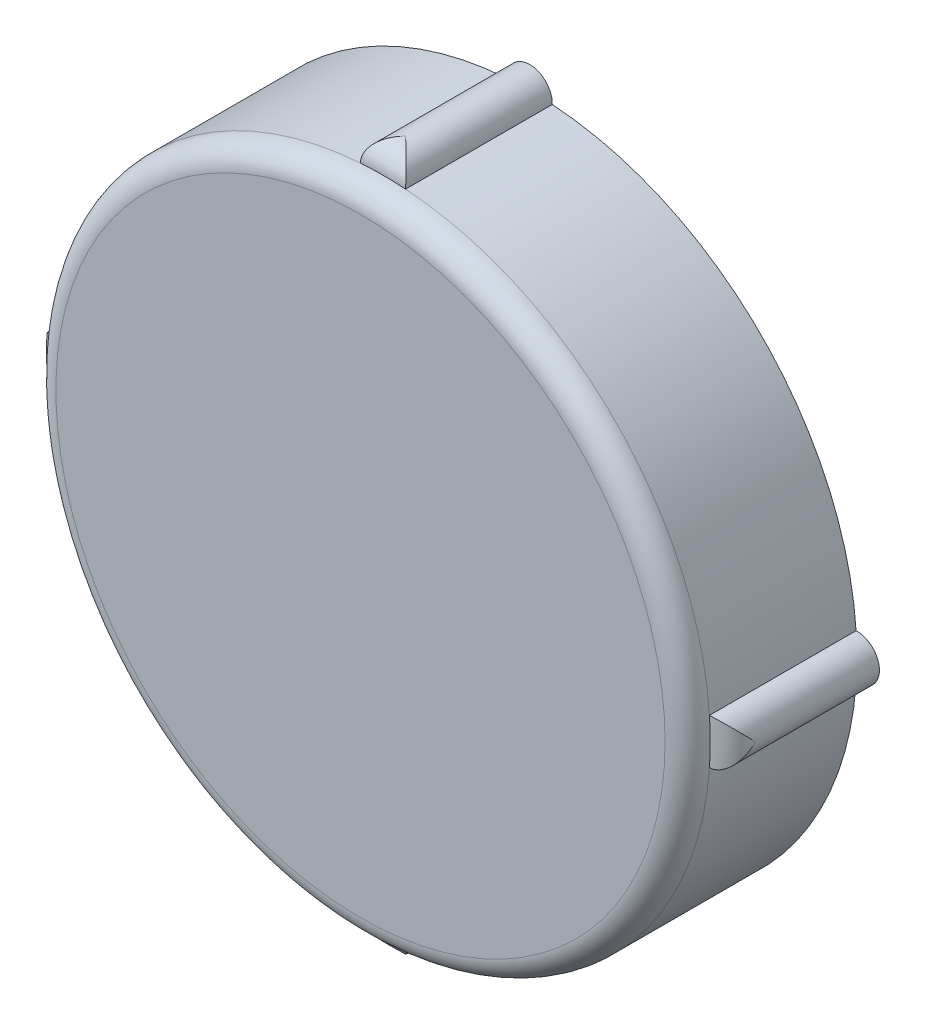
ISO-10303-21;
HEADER;
FILE_DESCRIPTION(('STEP AP214'),'2;1');
FILE_NAME('part.step','',(''),(''),'','','');
FILE_SCHEMA(('AUTOMOTIVE_DESIGN { 1 0 10303 214 1 1 1 1 }'));
ENDSEC;
DATA;
#1=APPLICATION_CONTEXT('core data for automotive mechanical design processes');
#2=APPLICATION_PROTOCOL_DEFINITION('international standard','automotive_design',2000,#1);
#3=PRODUCT_CONTEXT('',#1,'mechanical');
#4=PRODUCT('Part','Part','',(#3));
#5=PRODUCT_RELATED_PRODUCT_CATEGORY('part','',(#4));
#6=PRODUCT_DEFINITION_FORMATION('','',#4);
#7=PRODUCT_DEFINITION_CONTEXT('part definition',#1,'design');
#8=PRODUCT_DEFINITION('design','',#6,#7);
#9=PRODUCT_DEFINITION_SHAPE('','',#8);
#10=(LENGTH_UNIT() NAMED_UNIT(*) SI_UNIT(.MILLI.,.METRE.));
#11=(NAMED_UNIT(*) PLANE_ANGLE_UNIT() SI_UNIT($,.RADIAN.));
#12=(NAMED_UNIT(*) SI_UNIT($,.STERADIAN.) SOLID_ANGLE_UNIT());
#13=UNCERTAINTY_MEASURE_WITH_UNIT(LENGTH_MEASURE(1.E-05),#10,'distance_accuracy_value','');
#14=(GEOMETRIC_REPRESENTATION_CONTEXT(3) GLOBAL_UNCERTAINTY_ASSIGNED_CONTEXT((#13)) GLOBAL_UNIT_ASSIGNED_CONTEXT((#10,
#11,#12)) REPRESENTATION_CONTEXT('',''));
#15=CARTESIAN_POINT('',(0.,0.,0.));
#16=DIRECTION('',(0.,0.,1.));
#17=DIRECTION('',(1.,0.,0.));
#18=AXIS2_PLACEMENT_3D('',#15,#16,#17);
#19=CARTESIAN_POINT('',(-1.44999999999997,0.,1.5));
#20=DIRECTION('',(0.,0.,1.));
#21=DIRECTION('',(1.,0.,0.));
#22=AXIS2_PLACEMENT_3D('',#19,#20,#21);
#23=PLANE('',#22);
#24=CARTESIAN_POINT('',(0.,0.,1.5));
#25=DIRECTION('',(0.,0.,1.));
#26=DIRECTION('',(1.,0.,0.));
#27=AXIS2_PLACEMENT_3D('',#24,#25,#26);
#28=CIRCLE('',#27,2.7);
#29=CARTESIAN_POINT('',(2.7,0.,1.5));
#30=VERTEX_POINT('',#29);
#31=EDGE_CURVE('E108',#30,#30,#28,.T.);
#32=ORIENTED_EDGE('',*,*,#31,.T.);
#33=EDGE_LOOP('',(#32));
#34=FACE_BOUND('',#33,.T.);
#35=ADVANCED_FACE('F17',(#34),#23,.T.);
#36=CARTESIAN_POINT('',(0.,0.,1.09999999999997));
#37=DIRECTION('',(0.,0.,1.));
#38=DIRECTION('',(1.,0.,0.));
#39=AXIS2_PLACEMENT_3D('',#36,#37,#38);
#40=TOROIDAL_SURFACE('',#39,2.9,0.200000000000033);
#41=CARTESIAN_POINT('',(-3.1,0.,1.09999999999997));
#42=CARTESIAN_POINT('',(-3.09999999273906,-0.000700614208434327,1.10067763707031));
#43=CARTESIAN_POINT('',(-3.09999631194759,-0.00140128762079217,1.10135533129542));
#44=CARTESIAN_POINT('',(-3.09983002729009,-0.0172362373047448,1.11667103753092));
#45=CARTESIAN_POINT('',(-3.09795559955369,-0.0323863759887062,1.131325984968));
#46=CARTESIAN_POINT('',(-3.09068963107966,-0.0622438882966288,1.16028204941476));
#47=CARTESIAN_POINT('',(-3.08529060060688,-0.0769502491148912,1.17458234547226));
#48=CARTESIAN_POINT('',(-3.07268564953891,-0.101573484493427,1.1986559883607));
#49=CARTESIAN_POINT('',(-3.0663311564663,-0.11173100955897,1.20862899653874));
#50=CARTESIAN_POINT('',(-3.05148499948416,-0.131153515272455,1.22781599272848));
#51=CARTESIAN_POINT('',(-3.04299796124046,-0.140420368476927,1.23703156698819));
#52=CARTESIAN_POINT('',(-3.02625899628176,-0.155403486252823,1.25206965096497));
#53=CARTESIAN_POINT('',(-3.01851123683426,-0.161418995113649,1.25815418041416));
#54=CARTESIAN_POINT('',(-3.00176129846643,-0.172467229358271,1.26944109993591));
#55=CARTESIAN_POINT('',(-2.99276045364123,-0.177500986455111,1.27464441530186));
#56=CARTESIAN_POINT('',(-2.97554483255808,-0.185373587121745,1.28291188776244));
#57=CARTESIAN_POINT('',(-2.96754538144594,-0.188450761401843,1.28619589740385));
#58=CARTESIAN_POINT('',(-2.95092474100949,-0.193602679436099,1.29181778451126));
#59=CARTESIAN_POINT('',(-2.94230507102493,-0.195679782996262,1.2941578871173));
#60=CARTESIAN_POINT('',(-2.92688075000495,-0.198298015147555,1.29727067885822));
#61=CARTESIAN_POINT('',(-2.92016856173097,-0.199094778007368,1.29829012484653));
#62=CARTESIAN_POINT('',(-2.90660424118314,-0.200008243779966,1.29966190987251));
#63=CARTESIAN_POINT('',(-2.89975165374054,-0.200122191460087,1.30001154228836));
#64=CARTESIAN_POINT('',(-2.8929034482759,-0.199874057730429,1.29999989999308));
#65=B_SPLINE_CURVE_WITH_KNOTS('',3,(#41,#42,#43,#44,#45,#46,#47,#48,#49,#50,#51,#52,#53,#54,#55,
#56,#57,#58,#59,#60,#61,#62,#63,#64),.UNSPECIFIED.,.F.,.F.,(4,2,2,2,2,2,2,2,2,2,2,4),(0.,
0.00292435397274092,0.0660860612468741,0.129382425146232,0.175994141344857,0.222505612746202,
0.257018304958224,0.291494530356806,0.318924434612491,0.34628929306874,0.366731636542459,
0.38725641182236),.UNSPECIFIED.);
#66=CARTESIAN_POINT('',(-3.1,0.,1.1));
#67=VERTEX_POINT('',#66);
#68=CARTESIAN_POINT('',(-2.89310344827586,-0.199881058568127,1.3));
#69=VERTEX_POINT('',#68);
#70=EDGE_CURVE('E166',#67,#69,#65,.T.);
#71=ORIENTED_EDGE('',*,*,#70,.T.);
#72=CARTESIAN_POINT('',(0.,0.,1.3));
#73=DIRECTION('',(0.,0.,1.));
#74=DIRECTION('',(1.,0.,0.));
#75=AXIS2_PLACEMENT_3D('',#72,#73,#74);
#76=CIRCLE('',#75,2.9);
#77=CARTESIAN_POINT('',(-2.89310344827586,0.199881058568128,1.3));
#78=VERTEX_POINT('',#77);
#79=EDGE_CURVE('E255',#78,#69,#76,.T.);
#80=ORIENTED_EDGE('',*,*,#79,.F.);
#81=CARTESIAN_POINT('',(-2.8929034482759,0.199874057730429,1.29999989999308));
#82=CARTESIAN_POINT('',(-2.90194135858426,0.20020994328363,1.30002313952557));
#83=CARTESIAN_POINT('',(-2.91097799141657,0.199903014092768,1.29940609713252));
#84=CARTESIAN_POINT('',(-2.92870636445967,0.198123602133347,1.29703590797246));
#85=CARTESIAN_POINT('',(-2.93740042546401,0.196661309212666,1.2952927177776));
#86=CARTESIAN_POINT('',(-2.95424290658097,0.192699059531526,1.29081706786975));
#87=CARTESIAN_POINT('',(-2.96239288120379,0.190202220090614,1.28808758321569));
#88=CARTESIAN_POINT('',(-2.97804881528611,0.184332331491553,1.28180961594076));
#89=CARTESIAN_POINT('',(-2.98555322722308,0.180957250869593,1.2782592366551));
#90=CARTESIAN_POINT('',(-3.00272044359463,0.171978545464599,1.26893307750987));
#91=CARTESIAN_POINT('',(-3.01202727018833,0.16602585689514,1.26283823133659));
#92=CARTESIAN_POINT('',(-3.02915146479563,0.153086692518183,1.24973063793625));
#93=CARTESIAN_POINT('',(-3.03696616660571,0.146098405087826,1.2427162847041));
#94=CARTESIAN_POINT('',(-3.05367905093269,0.12874461083117,1.22542010277932));
#95=CARTESIAN_POINT('',(-3.06196743048977,0.118064312807053,1.21486600150491));
#96=CARTESIAN_POINT('',(-3.07603496342356,0.0958384277029507,1.19303228986648));
#97=CARTESIAN_POINT('',(-3.08181094816261,0.0842917693513861,1.18175178381453));
#98=CARTESIAN_POINT('',(-3.09084503575554,0.0610618574946664,1.15913612531301));
#99=CARTESIAN_POINT('',(-3.09417601996062,0.0493940842975443,1.14781363975298));
#100=CARTESIAN_POINT('',(-3.09868334869374,0.0258489727806531,1.12500235833107));
#101=CARTESIAN_POINT('',(-3.09986424670519,0.0139721312533827,1.11351396599669));
#102=CARTESIAN_POINT('',(-3.0999963152211,0.00140129824092625,1.10135534149079));
#103=CARTESIAN_POINT('',(-3.09999999633649,0.000700624737665341,1.10067764717288));
#104=CARTESIAN_POINT('',(-3.1,0.,1.09999999999997));
#105=B_SPLINE_CURVE_WITH_KNOTS('',3,(#81,#82,#83,#84,#85,#86,#87,#88,#89,#90,#91,#92,#93,#94,
#95,#96,#97,#98,#99,#100,#101,#102,#103,#104),.UNSPECIFIED.,.F.,.F.,(4,2,2,2,2,2,2,2,2,2,2,4),
(0.,0.0270503088519829,0.0538646724244197,0.0805988192393187,0.107395363305638,
0.145039144103675,0.18274957181307,0.233927901823098,0.285170592209757,0.334815792885159,
0.384355731399879,0.38728008537262),.UNSPECIFIED.);
#106=EDGE_CURVE('E162',#78,#67,#105,.T.);
#107=ORIENTED_EDGE('',*,*,#106,.T.);
#108=EDGE_LOOP('',(#71,#80,#107));
#109=FACE_BOUND('',#108,.T.);
#110=ADVANCED_FACE('F134',(#109),#40,.T.);
#111=CARTESIAN_POINT('',(0.,-3.1,1.09999999999997));
#112=CARTESIAN_POINT('',(0.000700614208434327,-3.09999999273906,1.10067763707031));
#113=CARTESIAN_POINT('',(0.00140128762079217,-3.09999631194759,1.10135533129542));
#114=CARTESIAN_POINT('',(0.0172362373047448,-3.09983002729009,1.11667103753092));
#115=CARTESIAN_POINT('',(0.0323863759887062,-3.09795559955369,1.131325984968));
#116=CARTESIAN_POINT('',(0.0622438882966288,-3.09068963107966,1.16028204941476));
#117=CARTESIAN_POINT('',(0.0769502491148912,-3.08529060060688,1.17458234547226));
#118=CARTESIAN_POINT('',(0.101573484493427,-3.07268564953891,1.1986559883607));
#119=CARTESIAN_POINT('',(0.11173100955897,-3.0663311564663,1.20862899653874));
#120=CARTESIAN_POINT('',(0.131153515272455,-3.05148499948416,1.22781599272848));
#121=CARTESIAN_POINT('',(0.140420368476927,-3.04299796124046,1.23703156698819));
#122=CARTESIAN_POINT('',(0.155403486252823,-3.02625899628176,1.25206965096497));
#123=CARTESIAN_POINT('',(0.161418995113649,-3.01851123683426,1.25815418041416));
#124=CARTESIAN_POINT('',(0.172467229358271,-3.00176129846643,1.26944109993591));
#125=CARTESIAN_POINT('',(0.177500986455111,-2.99276045364123,1.27464441530186));
#126=CARTESIAN_POINT('',(0.185373587121745,-2.97554483255808,1.28291188776244));
#127=CARTESIAN_POINT('',(0.188450761401843,-2.96754538144594,1.28619589740385));
#128=CARTESIAN_POINT('',(0.193602679436099,-2.95092474100949,1.29181778451126));
#129=CARTESIAN_POINT('',(0.195679782996262,-2.94230507102493,1.2941578871173));
#130=CARTESIAN_POINT('',(0.198298015147555,-2.92688075000495,1.29727067885822));
#131=CARTESIAN_POINT('',(0.199094778007368,-2.92016856173097,1.29829012484653));
#132=CARTESIAN_POINT('',(0.200008243779966,-2.90660424118314,1.29966190987251));
#133=CARTESIAN_POINT('',(0.200122191460087,-2.89975165374054,1.30001154228836));
#134=CARTESIAN_POINT('',(0.199874057730429,-2.8929034482759,1.29999989999308));
#135=B_SPLINE_CURVE_WITH_KNOTS('',3,(#111,#112,#113,#114,#115,#116,#117,#118,#119,#120,#121,
#122,#123,#124,#125,#126,#127,#128,#129,#130,#131,#132,#133,#134),.UNSPECIFIED.,.F.,.F.,(4,2,2,
2,2,2,2,2,2,2,2,4),(0.,0.00292435397274092,0.0660860612468741,0.129382425146232,
0.175994141344857,0.222505612746202,0.257018304958224,0.291494530356806,0.318924434612491,
0.34628929306874,0.366731636542459,0.38725641182236),.UNSPECIFIED.);
#136=CARTESIAN_POINT('',(0.,-3.1,1.1));
#137=VERTEX_POINT('',#136);
#138=CARTESIAN_POINT('',(0.199881058568127,-2.89310344827586,1.3));
#139=VERTEX_POINT('',#138);
#140=EDGE_CURVE('E116',#137,#139,#135,.T.);
#141=ORIENTED_EDGE('',*,*,#140,.T.);
#142=CARTESIAN_POINT('',(-0.199881058568128,-2.89310344827586,1.3));
#143=VERTEX_POINT('',#142);
#144=EDGE_CURVE('E224',#143,#139,#76,.T.);
#145=ORIENTED_EDGE('',*,*,#144,.F.);
#146=CARTESIAN_POINT('',(-0.199874057730429,-2.8929034482759,1.29999989999308));
#147=CARTESIAN_POINT('',(-0.20020994328363,-2.90194135858426,1.30002313952557));
#148=CARTESIAN_POINT('',(-0.199903014092768,-2.91097799141657,1.29940609713252));
#149=CARTESIAN_POINT('',(-0.198123602133347,-2.92870636445967,1.29703590797246));
#150=CARTESIAN_POINT('',(-0.196661309212666,-2.93740042546401,1.2952927177776));
#151=CARTESIAN_POINT('',(-0.192699059531526,-2.95424290658097,1.29081706786975));
#152=CARTESIAN_POINT('',(-0.190202220090614,-2.96239288120379,1.28808758321569));
#153=CARTESIAN_POINT('',(-0.184332331491553,-2.97804881528611,1.28180961594076));
#154=CARTESIAN_POINT('',(-0.180957250869593,-2.98555322722308,1.2782592366551));
#155=CARTESIAN_POINT('',(-0.171978545464599,-3.00272044359463,1.26893307750987));
#156=CARTESIAN_POINT('',(-0.16602585689514,-3.01202727018833,1.26283823133659));
#157=CARTESIAN_POINT('',(-0.153086692518183,-3.02915146479563,1.24973063793625));
#158=CARTESIAN_POINT('',(-0.146098405087826,-3.03696616660571,1.2427162847041));
#159=CARTESIAN_POINT('',(-0.12874461083117,-3.05367905093269,1.22542010277932));
#160=CARTESIAN_POINT('',(-0.118064312807053,-3.06196743048977,1.21486600150491));
#161=CARTESIAN_POINT('',(-0.0958384277029507,-3.07603496342356,1.19303228986648));
#162=CARTESIAN_POINT('',(-0.0842917693513861,-3.08181094816261,1.18175178381453));
#163=CARTESIAN_POINT('',(-0.0610618574946664,-3.09084503575554,1.15913612531301));
#164=CARTESIAN_POINT('',(-0.0493940842975443,-3.09417601996062,1.14781363975298));
#165=CARTESIAN_POINT('',(-0.0258489727806531,-3.09868334869374,1.12500235833107));
#166=CARTESIAN_POINT('',(-0.0139721312533827,-3.09986424670519,1.11351396599669));
#167=CARTESIAN_POINT('',(-0.00140129824092625,-3.0999963152211,1.10135534149079));
#168=CARTESIAN_POINT('',(-0.000700624737665341,-3.09999999633649,1.10067764717288));
#169=CARTESIAN_POINT('',(0.,-3.1,1.09999999999997));
#170=B_SPLINE_CURVE_WITH_KNOTS('',3,(#146,#147,#148,#149,#150,#151,#152,#153,#154,#155,#156,
#157,#158,#159,#160,#161,#162,#163,#164,#165,#166,#167,#168,#169),.UNSPECIFIED.,.F.,.F.,(4,2,2,
2,2,2,2,2,2,2,2,4),(0.,0.0270503088519829,0.0538646724244197,0.0805988192393187,
0.107395363305638,0.145039144103675,0.18274957181307,0.233927901823098,0.285170592209757,
0.334815792885159,0.384355731399879,0.38728008537262),.UNSPECIFIED.);
#171=EDGE_CURVE('E114',#143,#137,#170,.T.);
#172=ORIENTED_EDGE('',*,*,#171,.T.);
#173=EDGE_LOOP('',(#141,#145,#172));
#174=FACE_BOUND('',#173,.T.);
#175=ADVANCED_FACE('F139',(#174),#40,.T.);
#176=CARTESIAN_POINT('',(3.1,0.,1.09999999999997));
#177=CARTESIAN_POINT('',(3.09999999273906,0.000700614208434327,1.10067763707031));
#178=CARTESIAN_POINT('',(3.09999631194759,0.00140128762079217,1.10135533129542));
#179=CARTESIAN_POINT('',(3.09983002729009,0.0172362373047448,1.11667103753092));
#180=CARTESIAN_POINT('',(3.09795559955369,0.0323863759887062,1.131325984968));
#181=CARTESIAN_POINT('',(3.09068963107966,0.0622438882966288,1.16028204941476));
#182=CARTESIAN_POINT('',(3.08529060060688,0.0769502491148912,1.17458234547226));
#183=CARTESIAN_POINT('',(3.07268564953891,0.101573484493427,1.1986559883607));
#184=CARTESIAN_POINT('',(3.0663311564663,0.11173100955897,1.20862899653874));
#185=CARTESIAN_POINT('',(3.05148499948416,0.131153515272455,1.22781599272848));
#186=CARTESIAN_POINT('',(3.04299796124046,0.140420368476927,1.23703156698819));
#187=CARTESIAN_POINT('',(3.02625899628176,0.155403486252823,1.25206965096497));
#188=CARTESIAN_POINT('',(3.01851123683426,0.161418995113649,1.25815418041416));
#189=CARTESIAN_POINT('',(3.00176129846643,0.172467229358271,1.26944109993591));
#190=CARTESIAN_POINT('',(2.99276045364123,0.177500986455111,1.27464441530186));
#191=CARTESIAN_POINT('',(2.97554483255808,0.185373587121745,1.28291188776244));
#192=CARTESIAN_POINT('',(2.96754538144594,0.188450761401843,1.28619589740385));
#193=CARTESIAN_POINT('',(2.95092474100949,0.193602679436099,1.29181778451126));
#194=CARTESIAN_POINT('',(2.94230507102493,0.195679782996262,1.2941578871173));
#195=CARTESIAN_POINT('',(2.92688075000495,0.198298015147555,1.29727067885822));
#196=CARTESIAN_POINT('',(2.92016856173097,0.199094778007368,1.29829012484653));
#197=CARTESIAN_POINT('',(2.90660424118314,0.200008243779966,1.29966190987251));
#198=CARTESIAN_POINT('',(2.89975165374054,0.200122191460087,1.30001154228836));
#199=CARTESIAN_POINT('',(2.8929034482759,0.199874057730429,1.29999989999308));
#200=B_SPLINE_CURVE_WITH_KNOTS('',3,(#176,#177,#178,#179,#180,#181,#182,#183,#184,#185,#186,
#187,#188,#189,#190,#191,#192,#193,#194,#195,#196,#197,#198,#199),.UNSPECIFIED.,.F.,.F.,(4,2,2,
2,2,2,2,2,2,2,2,4),(0.,0.00292435397274092,0.0660860612468741,0.129382425146232,
0.175994141344857,0.222505612746202,0.257018304958224,0.291494530356806,0.318924434612491,
0.34628929306874,0.366731636542459,0.38725641182236),.UNSPECIFIED.);
#201=CARTESIAN_POINT('',(3.1,0.,1.1));
#202=VERTEX_POINT('',#201);
#203=CARTESIAN_POINT('',(2.89310344827586,0.199881058568127,1.3));
#204=VERTEX_POINT('',#203);
#205=EDGE_CURVE('E103',#202,#204,#200,.T.);
#206=ORIENTED_EDGE('',*,*,#205,.T.);
#207=CARTESIAN_POINT('',(2.89310344827586,-0.199881058568126,1.3));
#208=VERTEX_POINT('',#207);
#209=EDGE_CURVE('E104',#208,#204,#76,.T.);
#210=ORIENTED_EDGE('',*,*,#209,.F.);
#211=CARTESIAN_POINT('',(2.8929034482759,-0.199874057730429,1.29999989999308));
#212=CARTESIAN_POINT('',(2.90194135858426,-0.20020994328363,1.30002313952557));
#213=CARTESIAN_POINT('',(2.91097799141657,-0.199903014092768,1.29940609713252));
#214=CARTESIAN_POINT('',(2.92870636445967,-0.198123602133347,1.29703590797246));
#215=CARTESIAN_POINT('',(2.93740042546401,-0.196661309212666,1.2952927177776));
#216=CARTESIAN_POINT('',(2.95424290658097,-0.192699059531526,1.29081706786975));
#217=CARTESIAN_POINT('',(2.96239288120379,-0.190202220090614,1.28808758321569));
#218=CARTESIAN_POINT('',(2.97804881528611,-0.184332331491553,1.28180961594076));
#219=CARTESIAN_POINT('',(2.98555322722308,-0.180957250869593,1.2782592366551));
#220=CARTESIAN_POINT('',(3.00272044359463,-0.171978545464599,1.26893307750987));
#221=CARTESIAN_POINT('',(3.01202727018833,-0.16602585689514,1.26283823133659));
#222=CARTESIAN_POINT('',(3.02915146479563,-0.153086692518183,1.24973063793625));
#223=CARTESIAN_POINT('',(3.03696616660571,-0.146098405087826,1.2427162847041));
#224=CARTESIAN_POINT('',(3.05367905093269,-0.12874461083117,1.22542010277932));
#225=CARTESIAN_POINT('',(3.06196743048977,-0.118064312807053,1.21486600150491));
#226=CARTESIAN_POINT('',(3.07603496342356,-0.0958384277029507,1.19303228986648));
#227=CARTESIAN_POINT('',(3.08181094816261,-0.0842917693513861,1.18175178381453));
#228=CARTESIAN_POINT('',(3.09084503575554,-0.0610618574946664,1.15913612531301));
#229=CARTESIAN_POINT('',(3.09417601996062,-0.0493940842975443,1.14781363975298));
#230=CARTESIAN_POINT('',(3.09868334869374,-0.0258489727806531,1.12500235833107));
#231=CARTESIAN_POINT('',(3.09986424670519,-0.0139721312533827,1.11351396599669));
#232=CARTESIAN_POINT('',(3.0999963152211,-0.00140129824092625,1.10135534149079));
#233=CARTESIAN_POINT('',(3.09999999633649,-0.000700624737665341,1.10067764717288));
#234=CARTESIAN_POINT('',(3.1,0.,1.09999999999997));
#235=B_SPLINE_CURVE_WITH_KNOTS('',3,(#211,#212,#213,#214,#215,#216,#217,#218,#219,#220,#221,
#222,#223,#224,#225,#226,#227,#228,#229,#230,#231,#232,#233,#234),.UNSPECIFIED.,.F.,.F.,(4,2,2,
2,2,2,2,2,2,2,2,4),(0.,0.0270503088519829,0.0538646724244197,0.0805988192393187,
0.107395363305638,0.145039144103675,0.18274957181307,0.233927901823098,0.285170592209757,
0.334815792885159,0.384355731399879,0.38728008537262),.UNSPECIFIED.);
#236=EDGE_CURVE('E100',#208,#202,#235,.T.);
#237=ORIENTED_EDGE('',*,*,#236,.T.);
#238=EDGE_LOOP('',(#206,#210,#237));
#239=FACE_BOUND('',#238,.T.);
#240=ADVANCED_FACE('F102',(#239),#40,.T.);
#241=CARTESIAN_POINT('',(0.,3.1,1.09999999999997));
#242=CARTESIAN_POINT('',(-0.000700614208434327,3.09999999273906,1.10067763707031));
#243=CARTESIAN_POINT('',(-0.00140128762079217,3.09999631194759,1.10135533129542));
#244=CARTESIAN_POINT('',(-0.0172362373047448,3.09983002729009,1.11667103753092));
#245=CARTESIAN_POINT('',(-0.0323863759887062,3.09795559955369,1.131325984968));
#246=CARTESIAN_POINT('',(-0.0622438882966288,3.09068963107966,1.16028204941476));
#247=CARTESIAN_POINT('',(-0.0769502491148912,3.08529060060688,1.17458234547226));
#248=CARTESIAN_POINT('',(-0.101573484493427,3.07268564953891,1.1986559883607));
#249=CARTESIAN_POINT('',(-0.11173100955897,3.0663311564663,1.20862899653874));
#250=CARTESIAN_POINT('',(-0.131153515272455,3.05148499948416,1.22781599272848));
#251=CARTESIAN_POINT('',(-0.140420368476927,3.04299796124046,1.23703156698819));
#252=CARTESIAN_POINT('',(-0.155403486252823,3.02625899628176,1.25206965096497));
#253=CARTESIAN_POINT('',(-0.161418995113649,3.01851123683426,1.25815418041416));
#254=CARTESIAN_POINT('',(-0.172467229358271,3.00176129846643,1.26944109993591));
#255=CARTESIAN_POINT('',(-0.177500986455111,2.99276045364123,1.27464441530186));
#256=CARTESIAN_POINT('',(-0.185373587121745,2.97554483255808,1.28291188776244));
#257=CARTESIAN_POINT('',(-0.188450761401843,2.96754538144594,1.28619589740385));
#258=CARTESIAN_POINT('',(-0.193602679436099,2.95092474100949,1.29181778451126));
#259=CARTESIAN_POINT('',(-0.195679782996262,2.94230507102493,1.2941578871173));
#260=CARTESIAN_POINT('',(-0.198298015147555,2.92688075000495,1.29727067885822));
#261=CARTESIAN_POINT('',(-0.199094778007368,2.92016856173097,1.29829012484653));
#262=CARTESIAN_POINT('',(-0.200008243779966,2.90660424118314,1.29966190987251));
#263=CARTESIAN_POINT('',(-0.200122191460087,2.89975165374054,1.30001154228836));
#264=CARTESIAN_POINT('',(-0.199874057730429,2.8929034482759,1.29999989999308));
#265=B_SPLINE_CURVE_WITH_KNOTS('',3,(#241,#242,#243,#244,#245,#246,#247,#248,#249,#250,#251,
#252,#253,#254,#255,#256,#257,#258,#259,#260,#261,#262,#263,#264),.UNSPECIFIED.,.F.,.F.,(4,2,2,
2,2,2,2,2,2,2,2,4),(0.,0.00292435397274092,0.0660860612468741,0.129382425146232,
0.175994141344857,0.222505612746202,0.257018304958224,0.291494530356806,0.318924434612491,
0.34628929306874,0.366731636542459,0.38725641182236),.UNSPECIFIED.);
#266=CARTESIAN_POINT('',(0.,3.1,1.1));
#267=VERTEX_POINT('',#266);
#268=CARTESIAN_POINT('',(-0.19988105856801,2.89310344827587,1.3));
#269=VERTEX_POINT('',#268);
#270=EDGE_CURVE('E11',#267,#269,#265,.T.);
#271=ORIENTED_EDGE('',*,*,#270,.T.);
#272=CARTESIAN_POINT('',(0.19988105856813,2.8931034482759,1.3));
#273=VERTEX_POINT('',#272);
#274=EDGE_CURVE('E218',#273,#269,#76,.T.);
#275=ORIENTED_EDGE('',*,*,#274,.F.);
#276=CARTESIAN_POINT('',(0.199874057730429,2.8929034482759,1.29999989999308));
#277=CARTESIAN_POINT('',(0.20020994328363,2.90194135858426,1.30002313952557));
#278=CARTESIAN_POINT('',(0.199903014092768,2.91097799141657,1.29940609713252));
#279=CARTESIAN_POINT('',(0.198123602133347,2.92870636445967,1.29703590797246));
#280=CARTESIAN_POINT('',(0.196661309212666,2.93740042546401,1.2952927177776));
#281=CARTESIAN_POINT('',(0.192699059531526,2.95424290658097,1.29081706786975));
#282=CARTESIAN_POINT('',(0.190202220090614,2.96239288120379,1.28808758321569));
#283=CARTESIAN_POINT('',(0.184332331491554,2.9780488152861,1.28180961594076));
#284=CARTESIAN_POINT('',(0.180957250869593,2.98555322722308,1.2782592366551));
#285=CARTESIAN_POINT('',(0.171978545464599,3.00272044359463,1.26893307750987));
#286=CARTESIAN_POINT('',(0.16602585689514,3.01202727018833,1.26283823133659));
#287=CARTESIAN_POINT('',(0.153086692518183,3.02915146479563,1.24973063793625));
#288=CARTESIAN_POINT('',(0.146098405087827,3.03696616660571,1.2427162847041));
#289=CARTESIAN_POINT('',(0.128744610831171,3.0536790509327,1.22542010277932));
#290=CARTESIAN_POINT('',(0.118064312807053,3.06196743048977,1.21486600150491));
#291=CARTESIAN_POINT('',(0.0958384277029513,3.07603496342356,1.19303228986648));
#292=CARTESIAN_POINT('',(0.0842917693513881,3.08181094816261,1.18175178381453));
#293=CARTESIAN_POINT('',(0.061061857494667,3.09084503575554,1.15913612531301));
#294=CARTESIAN_POINT('',(0.0493940842975425,3.09417601996062,1.14781363975299));
#295=CARTESIAN_POINT('',(0.0258489727806547,3.09868334869374,1.12500235833107));
#296=CARTESIAN_POINT('',(0.0139721312533902,3.09986424670519,1.11351396599669));
#297=CARTESIAN_POINT('',(0.00140129824092677,3.0999963152211,1.10135534149078));
#298=CARTESIAN_POINT('',(0.000700624737665621,3.09999999633649,1.10067764717288));
#299=CARTESIAN_POINT('',(0.,3.1,1.09999999999997));
#300=B_SPLINE_CURVE_WITH_KNOTS('',3,(#276,#277,#278,#279,#280,#281,#282,#283,#284,#285,#286,
#287,#288,#289,#290,#291,#292,#293,#294,#295,#296,#297,#298,#299),.UNSPECIFIED.,.F.,.F.,(4,2,2,
2,2,2,2,2,2,2,2,4),(0.,0.0270503088519829,0.0538646724244197,0.0805988192393187,
0.107395363305638,0.145039144103674,0.18274957181307,0.233927901823098,0.285170592209756,
0.334815792885159,0.38435573139988,0.38728008537262),.UNSPECIFIED.);
#301=EDGE_CURVE('E30',#273,#267,#300,.T.);
#302=ORIENTED_EDGE('',*,*,#301,.T.);
#303=EDGE_LOOP('',(#271,#275,#302));
#304=FACE_BOUND('',#303,.T.);
#305=ADVANCED_FACE('F141',(#304),#40,.T.);
#306=CARTESIAN_POINT('',(0.,0.,1.29999999999997));
#307=DIRECTION('',(0.,0.,1.));
#308=DIRECTION('',(1.,0.,0.));
#309=AXIS2_PLACEMENT_3D('',#306,#307,#308);
#310=TOROIDAL_SURFACE('',#309,2.69999999999997,0.200000000000033);
#311=EDGE_CURVE('E37',#204,#273,#76,.T.);
#312=ORIENTED_EDGE('',*,*,#311,.T.);
#313=ORIENTED_EDGE('',*,*,#274,.T.);
#314=EDGE_CURVE('E220',#269,#78,#76,.T.);
#315=ORIENTED_EDGE('',*,*,#314,.T.);
#316=ORIENTED_EDGE('',*,*,#79,.T.);
#317=EDGE_CURVE('E300',#69,#143,#76,.T.);
#318=ORIENTED_EDGE('',*,*,#317,.T.);
#319=ORIENTED_EDGE('',*,*,#144,.T.);
#320=EDGE_CURVE('E222',#139,#208,#76,.T.);
#321=ORIENTED_EDGE('',*,*,#320,.T.);
#322=ORIENTED_EDGE('',*,*,#209,.T.);
#323=EDGE_LOOP('',(#312,#313,#315,#316,#318,#319,#321,#322));
#324=FACE_BOUND('',#323,.T.);
#325=ORIENTED_EDGE('',*,*,#31,.F.);
#326=EDGE_LOOP('',(#325));
#327=FACE_BOUND('',#326,.T.);
#328=ADVANCED_FACE('F144',(#324,#327),#310,.T.);
#329=CARTESIAN_POINT('',(-1.44999999999997,0.,0.));
#330=DIRECTION('',(0.,0.,1.));
#331=DIRECTION('',(1.,0.,0.));
#332=AXIS2_PLACEMENT_3D('',#329,#330,#331);
#333=PLANE('',#332);
#334=CARTESIAN_POINT('',(0.,0.,0.));
#335=DIRECTION('',(0.,0.,1.));
#336=DIRECTION('',(1.,0.,0.));
#337=AXIS2_PLACEMENT_3D('',#334,#335,#336);
#338=CIRCLE('',#337,2.90000000000004);
#339=CARTESIAN_POINT('',(-0.19988105856813,2.8931034482759,0.));
#340=VERTEX_POINT('',#339);
#341=CARTESIAN_POINT('',(-2.8931034482759,0.19988105856813,0.));
#342=VERTEX_POINT('',#341);
#343=EDGE_CURVE('E278',#340,#342,#338,.T.);
#344=ORIENTED_EDGE('',*,*,#343,.F.);
#345=CARTESIAN_POINT('',(0.,2.9,0.));
#346=DIRECTION('',(0.,0.,1.));
#347=DIRECTION('',(1.,0.,0.));
#348=AXIS2_PLACEMENT_3D('',#345,#346,#347);
#349=CIRCLE('',#348,0.2);
#350=CARTESIAN_POINT('',(0.19988105856813,2.8931034482759,0.));
#351=VERTEX_POINT('',#350);
#352=EDGE_CURVE('E45',#351,#340,#349,.T.);
#353=ORIENTED_EDGE('',*,*,#352,.F.);
#354=CARTESIAN_POINT('',(0.,0.,0.));
#355=DIRECTION('',(0.,0.,1.));
#356=DIRECTION('',(1.,0.,0.));
#357=AXIS2_PLACEMENT_3D('',#354,#355,#356);
#358=CIRCLE('',#357,2.9);
#359=CARTESIAN_POINT('',(2.8931034482759,0.19988105856813,0.));
#360=VERTEX_POINT('',#359);
#361=EDGE_CURVE('E260',#360,#351,#358,.T.);
#362=ORIENTED_EDGE('',*,*,#361,.F.);
#363=CARTESIAN_POINT('',(2.9,0.,0.));
#364=DIRECTION('',(0.,0.,1.));
#365=DIRECTION('',(1.,0.,0.));
#366=AXIS2_PLACEMENT_3D('',#363,#364,#365);
#367=CIRCLE('',#366,0.2);
#368=CARTESIAN_POINT('',(2.89310344827596,-0.199881058568134,0.));
#369=VERTEX_POINT('',#368);
#370=EDGE_CURVE('E277',#369,#360,#367,.T.);
#371=ORIENTED_EDGE('',*,*,#370,.F.);
#372=CARTESIAN_POINT('',(0.,0.,0.));
#373=DIRECTION('',(0.,0.,1.));
#374=DIRECTION('',(1.,0.,0.));
#375=AXIS2_PLACEMENT_3D('',#372,#373,#374);
#376=CIRCLE('',#375,2.90000000000004);
#377=CARTESIAN_POINT('',(0.19988105856813,-2.8931034482759,0.));
#378=VERTEX_POINT('',#377);
#379=EDGE_CURVE('E288',#378,#369,#376,.T.);
#380=ORIENTED_EDGE('',*,*,#379,.F.);
#381=CARTESIAN_POINT('',(0.,-2.9,0.));
#382=DIRECTION('',(0.,0.,1.));
#383=DIRECTION('',(1.,0.,0.));
#384=AXIS2_PLACEMENT_3D('',#381,#382,#383);
#385=CIRCLE('',#384,0.2);
#386=CARTESIAN_POINT('',(-0.199881058568131,-2.8931034482759,0.));
#387=VERTEX_POINT('',#386);
#388=EDGE_CURVE('E286',#387,#378,#385,.T.);
#389=ORIENTED_EDGE('',*,*,#388,.F.);
#390=CARTESIAN_POINT('',(0.,0.,0.));
#391=DIRECTION('',(0.,0.,1.));
#392=DIRECTION('',(1.,0.,0.));
#393=AXIS2_PLACEMENT_3D('',#390,#391,#392);
#394=CIRCLE('',#393,2.9000000000001);
#395=CARTESIAN_POINT('',(-2.8931034482759,-0.19988105856813,0.));
#396=VERTEX_POINT('',#395);
#397=EDGE_CURVE('E281',#396,#387,#394,.T.);
#398=ORIENTED_EDGE('',*,*,#397,.F.);
#399=CARTESIAN_POINT('',(-2.9,0.,0.));
#400=DIRECTION('',(0.,0.,1.));
#401=DIRECTION('',(1.,0.,0.));
#402=AXIS2_PLACEMENT_3D('',#399,#400,#401);
#403=CIRCLE('',#402,0.2);
#404=EDGE_CURVE('E280',#342,#396,#403,.T.);
#405=ORIENTED_EDGE('',*,*,#404,.F.);
#406=EDGE_LOOP('',(#344,#353,#362,#371,#380,#389,#398,#405));
#407=FACE_BOUND('',#406,.T.);
#408=CARTESIAN_POINT('',(0.,0.,0.));
#409=DIRECTION('',(0.,0.,1.));
#410=DIRECTION('',(1.,0.,0.));
#411=AXIS2_PLACEMENT_3D('',#408,#409,#410);
#412=CIRCLE('',#411,2.1);
#413=CARTESIAN_POINT('',(2.1,0.,0.));
#414=VERTEX_POINT('',#413);
#415=EDGE_CURVE('E223',#414,#414,#412,.T.);
#416=ORIENTED_EDGE('',*,*,#415,.T.);
#417=EDGE_LOOP('',(#416));
#418=FACE_BOUND('',#417,.T.);
#419=ADVANCED_FACE('F202',(#407,#418),#333,.F.);
#420=CARTESIAN_POINT('',(0.,2.9,1.5));
#421=DIRECTION('',(0.,0.,-1.));
#422=DIRECTION('',(-1.,0.,0.));
#423=AXIS2_PLACEMENT_3D('',#420,#421,#422);
#424=CYLINDRICAL_SURFACE('',#423,0.2);
#425=ORIENTED_EDGE('',*,*,#301,.F.);
#426=DIRECTION('',(0.,0.,-1.));
#427=VECTOR('',#426,1.);
#428=CARTESIAN_POINT('',(0.19988105856813,2.8931034482759,1.5));
#429=LINE('',#428,#427);
#430=EDGE_CURVE('E217',#273,#351,#429,.T.);
#431=ORIENTED_EDGE('',*,*,#430,.T.);
#432=ORIENTED_EDGE('',*,*,#352,.T.);
#433=DIRECTION('',(0.,0.,-1.));
#434=VECTOR('',#433,1.);
#435=CARTESIAN_POINT('',(-0.19988105856813,2.8931034482759,1.5));
#436=LINE('',#435,#434);
#437=EDGE_CURVE('E250',#269,#340,#436,.T.);
#438=ORIENTED_EDGE('',*,*,#437,.F.);
#439=ORIENTED_EDGE('',*,*,#270,.F.);
#440=EDGE_LOOP('',(#425,#431,#432,#438,#439));
#441=FACE_BOUND('',#440,.T.);
#442=ADVANCED_FACE('F204',(#441),#424,.T.);
#443=CARTESIAN_POINT('',(0.,0.,1.5));
#444=DIRECTION('',(0.,0.,-1.));
#445=DIRECTION('',(-1.,0.,0.));
#446=AXIS2_PLACEMENT_3D('',#443,#444,#445);
#447=CYLINDRICAL_SURFACE('',#446,2.9);
#448=ORIENTED_EDGE('',*,*,#311,.F.);
#449=DIRECTION('',(0.,0.,-1.));
#450=VECTOR('',#449,1.);
#451=CARTESIAN_POINT('',(2.8931034482759,0.19988105856813,1.5));
#452=LINE('',#451,#450);
#453=EDGE_CURVE('E113',#204,#360,#452,.T.);
#454=ORIENTED_EDGE('',*,*,#453,.T.);
#455=ORIENTED_EDGE('',*,*,#361,.T.);
#456=ORIENTED_EDGE('',*,*,#430,.F.);
#457=EDGE_LOOP('',(#448,#454,#455,#456));
#458=FACE_BOUND('',#457,.T.);
#459=ADVANCED_FACE('F193',(#458),#447,.T.);
#460=CARTESIAN_POINT('',(2.9,0.,1.5));
#461=DIRECTION('',(0.,0.,-1.));
#462=DIRECTION('',(-1.,0.,0.));
#463=AXIS2_PLACEMENT_3D('',#460,#461,#462);
#464=CYLINDRICAL_SURFACE('',#463,0.2);
#465=ORIENTED_EDGE('',*,*,#236,.F.);
#466=DIRECTION('',(0.,0.,-1.));
#467=VECTOR('',#466,1.);
#468=CARTESIAN_POINT('',(2.89310344827596,-0.199881058568134,1.5));
#469=LINE('',#468,#467);
#470=EDGE_CURVE('E265',#208,#369,#469,.T.);
#471=ORIENTED_EDGE('',*,*,#470,.T.);
#472=ORIENTED_EDGE('',*,*,#370,.T.);
#473=ORIENTED_EDGE('',*,*,#453,.F.);
#474=ORIENTED_EDGE('',*,*,#205,.F.);
#475=EDGE_LOOP('',(#465,#471,#472,#473,#474));
#476=FACE_BOUND('',#475,.T.);
#477=ADVANCED_FACE('F111',(#476),#464,.T.);
#478=CARTESIAN_POINT('',(0.,0.,1.5));
#479=DIRECTION('',(0.,0.,-1.));
#480=DIRECTION('',(-1.,0.,0.));
#481=AXIS2_PLACEMENT_3D('',#478,#479,#480);
#482=CYLINDRICAL_SURFACE('',#481,2.90000000000004);
#483=ORIENTED_EDGE('',*,*,#320,.F.);
#484=DIRECTION('',(0.,0.,-1.));
#485=VECTOR('',#484,1.);
#486=CARTESIAN_POINT('',(0.19988105856813,-2.8931034482759,1.5));
#487=LINE('',#486,#485);
#488=EDGE_CURVE('E267',#139,#378,#487,.T.);
#489=ORIENTED_EDGE('',*,*,#488,.T.);
#490=ORIENTED_EDGE('',*,*,#379,.T.);
#491=ORIENTED_EDGE('',*,*,#470,.F.);
#492=EDGE_LOOP('',(#483,#489,#490,#491));
#493=FACE_BOUND('',#492,.T.);
#494=ADVANCED_FACE('F183',(#493),#482,.T.);
#495=CARTESIAN_POINT('',(0.,-2.9,1.5));
#496=DIRECTION('',(0.,0.,-1.));
#497=DIRECTION('',(-1.,0.,0.));
#498=AXIS2_PLACEMENT_3D('',#495,#496,#497);
#499=CYLINDRICAL_SURFACE('',#498,0.2);
#500=ORIENTED_EDGE('',*,*,#171,.F.);
#501=DIRECTION('',(0.,0.,-1.));
#502=VECTOR('',#501,1.);
#503=CARTESIAN_POINT('',(-0.199881058568131,-2.8931034482759,1.5));
#504=LINE('',#503,#502);
#505=EDGE_CURVE('E270',#143,#387,#504,.T.);
#506=ORIENTED_EDGE('',*,*,#505,.T.);
#507=ORIENTED_EDGE('',*,*,#388,.T.);
#508=ORIENTED_EDGE('',*,*,#488,.F.);
#509=ORIENTED_EDGE('',*,*,#140,.F.);
#510=EDGE_LOOP('',(#500,#506,#507,#508,#509));
#511=FACE_BOUND('',#510,.T.);
#512=ADVANCED_FACE('F179',(#511),#499,.T.);
#513=CARTESIAN_POINT('',(0.,0.,1.5));
#514=DIRECTION('',(0.,0.,-1.));
#515=DIRECTION('',(-1.,0.,0.));
#516=AXIS2_PLACEMENT_3D('',#513,#514,#515);
#517=CYLINDRICAL_SURFACE('',#516,2.9000000000001);
#518=ORIENTED_EDGE('',*,*,#317,.F.);
#519=DIRECTION('',(0.,0.,-1.));
#520=VECTOR('',#519,1.);
#521=CARTESIAN_POINT('',(-2.8931034482759,-0.19988105856813,1.5));
#522=LINE('',#521,#520);
#523=EDGE_CURVE('E272',#69,#396,#522,.T.);
#524=ORIENTED_EDGE('',*,*,#523,.T.);
#525=ORIENTED_EDGE('',*,*,#397,.T.);
#526=ORIENTED_EDGE('',*,*,#505,.F.);
#527=EDGE_LOOP('',(#518,#524,#525,#526));
#528=FACE_BOUND('',#527,.T.);
#529=ADVANCED_FACE('F175',(#528),#517,.T.);
#530=CARTESIAN_POINT('',(-2.9,0.,1.5));
#531=DIRECTION('',(0.,0.,-1.));
#532=DIRECTION('',(-1.,0.,0.));
#533=AXIS2_PLACEMENT_3D('',#530,#531,#532);
#534=CYLINDRICAL_SURFACE('',#533,0.2);
#535=ORIENTED_EDGE('',*,*,#106,.F.);
#536=DIRECTION('',(0.,0.,-1.));
#537=VECTOR('',#536,1.);
#538=CARTESIAN_POINT('',(-2.8931034482759,0.19988105856813,1.5));
#539=LINE('',#538,#537);
#540=EDGE_CURVE('E252',#78,#342,#539,.T.);
#541=ORIENTED_EDGE('',*,*,#540,.T.);
#542=ORIENTED_EDGE('',*,*,#404,.T.);
#543=ORIENTED_EDGE('',*,*,#523,.F.);
#544=ORIENTED_EDGE('',*,*,#70,.F.);
#545=EDGE_LOOP('',(#535,#541,#542,#543,#544));
#546=FACE_BOUND('',#545,.T.);
#547=ADVANCED_FACE('F171',(#546),#534,.T.);
#548=CARTESIAN_POINT('',(0.,0.,1.5));
#549=DIRECTION('',(0.,0.,-1.));
#550=DIRECTION('',(-1.,0.,0.));
#551=AXIS2_PLACEMENT_3D('',#548,#549,#550);
#552=CYLINDRICAL_SURFACE('',#551,2.90000000000004);
#553=ORIENTED_EDGE('',*,*,#314,.F.);
#554=ORIENTED_EDGE('',*,*,#437,.T.);
#555=ORIENTED_EDGE('',*,*,#343,.T.);
#556=ORIENTED_EDGE('',*,*,#540,.F.);
#557=EDGE_LOOP('',(#553,#554,#555,#556));
#558=FACE_BOUND('',#557,.T.);
#559=ADVANCED_FACE('F19',(#558),#552,.T.);
#560=CARTESIAN_POINT('',(0.,0.,1.2));
#561=DIRECTION('',(0.,0.,-1.));
#562=DIRECTION('',(-1.,0.,0.));
#563=AXIS2_PLACEMENT_3D('',#560,#561,#562);
#564=PLANE('',#563);
#565=CARTESIAN_POINT('',(0.,0.,1.2));
#566=DIRECTION('',(0.,0.,1.));
#567=DIRECTION('',(1.,0.,0.));
#568=AXIS2_PLACEMENT_3D('',#565,#566,#567);
#569=CIRCLE('',#568,2.1);
#570=CARTESIAN_POINT('',(2.1,0.,1.2));
#571=VERTEX_POINT('',#570);
#572=EDGE_CURVE('E226',#571,#571,#569,.T.);
#573=ORIENTED_EDGE('',*,*,#572,.F.);
#574=EDGE_LOOP('',(#573));
#575=FACE_BOUND('',#574,.T.);
#576=ADVANCED_FACE('F235',(#575),#564,.T.);
#577=CARTESIAN_POINT('',(0.,0.,0.));
#578=DIRECTION('',(0.,0.,1.));
#579=DIRECTION('',(1.,0.,0.));
#580=AXIS2_PLACEMENT_3D('',#577,#578,#579);
#581=CYLINDRICAL_SURFACE('',#580,2.1);
#582=ORIENTED_EDGE('',*,*,#572,.T.);
#583=EDGE_LOOP('',(#582));
#584=FACE_BOUND('',#583,.T.);
#585=ORIENTED_EDGE('',*,*,#415,.F.);
#586=EDGE_LOOP('',(#585));
#587=FACE_BOUND('',#586,.T.);
#588=ADVANCED_FACE('F142',(#584,#587),#581,.F.);
#589=CLOSED_SHELL('',(#35,#110,#175,#240,#305,#328,#419,#442,#459,#477,#494,#512,#529,#547,#559,
#576,#588));
#590=MANIFOLD_SOLID_BREP('B1',#589);
#591=ADVANCED_BREP_SHAPE_REPRESENTATION('',(#18,#590),#14);
#592=SHAPE_DEFINITION_REPRESENTATION(#9,#591);
ENDSEC;
END-ISO-10303-21;
